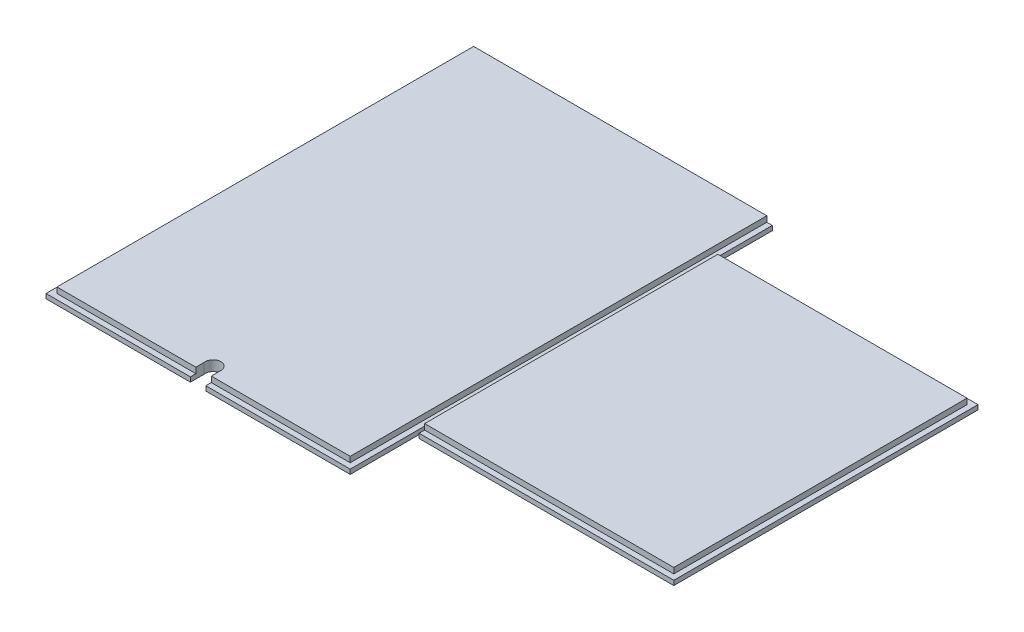
ISO-10303-21;
HEADER;
FILE_DESCRIPTION(('STEP AP214'),'2;1');
FILE_NAME('part.step','',(''),(''),'','','');
FILE_SCHEMA(('AUTOMOTIVE_DESIGN { 1 0 10303 214 1 1 1 1 }'));
ENDSEC;
DATA;
#1=APPLICATION_CONTEXT('core data for automotive mechanical design processes');
#2=APPLICATION_PROTOCOL_DEFINITION('international standard','automotive_design',2000,#1);
#3=PRODUCT_CONTEXT('',#1,'mechanical');
#4=PRODUCT('Part','Part','',(#3));
#5=PRODUCT_RELATED_PRODUCT_CATEGORY('part','',(#4));
#6=PRODUCT_DEFINITION_FORMATION('','',#4);
#7=PRODUCT_DEFINITION_CONTEXT('part definition',#1,'design');
#8=PRODUCT_DEFINITION('design','',#6,#7);
#9=PRODUCT_DEFINITION_SHAPE('','',#8);
#10=(LENGTH_UNIT() NAMED_UNIT(*) SI_UNIT(.MILLI.,.METRE.));
#11=(NAMED_UNIT(*) PLANE_ANGLE_UNIT() SI_UNIT($,.RADIAN.));
#12=(NAMED_UNIT(*) SI_UNIT($,.STERADIAN.) SOLID_ANGLE_UNIT());
#13=UNCERTAINTY_MEASURE_WITH_UNIT(LENGTH_MEASURE(1.E-05),#10,'distance_accuracy_value','');
#14=(GEOMETRIC_REPRESENTATION_CONTEXT(3) GLOBAL_UNCERTAINTY_ASSIGNED_CONTEXT((#13)) GLOBAL_UNIT_ASSIGNED_CONTEXT((#10,
#11,#12)) REPRESENTATION_CONTEXT('',''));
#15=CARTESIAN_POINT('',(0.,0.,0.));
#16=DIRECTION('',(0.,0.,1.));
#17=DIRECTION('',(1.,0.,0.));
#18=AXIS2_PLACEMENT_3D('',#15,#16,#17);
#19=CARTESIAN_POINT('',(32.2556284153005,3.,-34.5595316159251));
#20=DIRECTION('',(1.,0.,0.));
#21=DIRECTION('',(0.,0.,-1.));
#22=AXIS2_PLACEMENT_3D('',#19,#20,#21);
#23=PLANE('',#22);
#24=DIRECTION('',(0.,1.,0.));
#25=VECTOR('',#24,1.);
#26=CARTESIAN_POINT('',(32.2556284153005,1.35,52.8404683840749));
#27=LINE('',#26,#25);
#28=CARTESIAN_POINT('',(32.2556284153005,1.35,52.8404683840749));
#29=VERTEX_POINT('',#28);
#30=CARTESIAN_POINT('',(32.2556284153005,3.,52.8404683840749));
#31=VERTEX_POINT('',#30);
#32=EDGE_CURVE('E145',#29,#31,#27,.T.);
#33=ORIENTED_EDGE('',*,*,#32,.T.);
#34=DIRECTION('',(0.,0.,1.));
#35=VECTOR('',#34,1.);
#36=CARTESIAN_POINT('',(32.2556284153005,3.,-34.5595316159251));
#37=LINE('',#36,#35);
#38=CARTESIAN_POINT('',(32.2556284153005,3.,-32.9595316159251));
#39=VERTEX_POINT('',#38);
#40=EDGE_CURVE('E134',#39,#31,#37,.T.);
#41=ORIENTED_EDGE('',*,*,#40,.F.);
#42=DIRECTION('',(0.,1.,0.));
#43=VECTOR('',#42,1.);
#44=CARTESIAN_POINT('',(32.2556284153005,1.35,-32.9595316159251));
#45=LINE('',#44,#43);
#46=CARTESIAN_POINT('',(32.2556284153005,1.35,-32.9595316159251));
#47=VERTEX_POINT('',#46);
#48=EDGE_CURVE('E61',#47,#39,#45,.T.);
#49=ORIENTED_EDGE('',*,*,#48,.F.);
#50=DIRECTION('',(0.,0.,-1.));
#51=VECTOR('',#50,1.);
#52=CARTESIAN_POINT('',(32.2556284153005,1.35,-32.9595316159251));
#53=LINE('',#52,#51);
#54=CARTESIAN_POINT('',(32.2556284153005,1.35,-34.5595316159251));
#55=VERTEX_POINT('',#54);
#56=EDGE_CURVE('E155',#47,#55,#53,.T.);
#57=ORIENTED_EDGE('',*,*,#56,.T.);
#58=DIRECTION('',(0.,-1.,0.));
#59=VECTOR('',#58,1.);
#60=CARTESIAN_POINT('',(32.2556284153005,3.,-34.5595316159251));
#61=LINE('',#60,#59);
#62=CARTESIAN_POINT('',(32.2556284153005,0.,-34.5595316159251));
#63=VERTEX_POINT('',#62);
#64=EDGE_CURVE('E69',#55,#63,#61,.T.);
#65=ORIENTED_EDGE('',*,*,#64,.T.);
#66=DIRECTION('',(0.,0.,1.));
#67=VECTOR('',#66,1.);
#68=CARTESIAN_POINT('',(32.2556284153005,0.,-34.5595316159251));
#69=LINE('',#68,#67);
#70=CARTESIAN_POINT('',(32.2556284153005,0.,54.4404683840749));
#71=VERTEX_POINT('',#70);
#72=EDGE_CURVE('E143',#63,#71,#69,.T.);
#73=ORIENTED_EDGE('',*,*,#72,.T.);
#74=DIRECTION('',(0.,-1.,0.));
#75=VECTOR('',#74,1.);
#76=CARTESIAN_POINT('',(32.2556284153005,3.,54.4404683840749));
#77=LINE('',#76,#75);
#78=CARTESIAN_POINT('',(32.2556284153005,1.35,54.4404683840749));
#79=VERTEX_POINT('',#78);
#80=EDGE_CURVE('E12',#79,#71,#77,.T.);
#81=ORIENTED_EDGE('',*,*,#80,.F.);
#82=DIRECTION('',(0.,0.,-1.));
#83=VECTOR('',#82,1.);
#84=CARTESIAN_POINT('',(32.2556284153005,1.35,54.4404683840749));
#85=LINE('',#84,#83);
#86=EDGE_CURVE('E170',#79,#29,#85,.T.);
#87=ORIENTED_EDGE('',*,*,#86,.T.);
#88=EDGE_LOOP('',(#33,#41,#49,#57,#65,#73,#81,#87));
#89=FACE_BOUND('',#88,.T.);
#90=ADVANCED_FACE('F47',(#89),#23,.F.);
#91=CARTESIAN_POINT('',(0.,3.,0.));
#92=DIRECTION('',(0.,1.,0.));
#93=DIRECTION('',(0.,0.,1.));
#94=AXIS2_PLACEMENT_3D('',#91,#92,#93);
#95=PLANE('',#94);
#96=ORIENTED_EDGE('',*,*,#40,.T.);
#97=DIRECTION('',(1.,0.,0.));
#98=VECTOR('',#97,1.);
#99=CARTESIAN_POINT('',(32.2556284153005,3.,52.8404683840749));
#100=LINE('',#99,#98);
#101=CARTESIAN_POINT('',(105.155628415301,3.,52.8404683840749));
#102=VERTEX_POINT('',#101);
#103=EDGE_CURVE('E160',#31,#102,#100,.T.);
#104=ORIENTED_EDGE('',*,*,#103,.T.);
#105=DIRECTION('',(0.,0.,-1.));
#106=VECTOR('',#105,1.);
#107=CARTESIAN_POINT('',(105.155628415301,3.,52.8404683840749));
#108=LINE('',#107,#106);
#109=CARTESIAN_POINT('',(105.155628415301,3.,-32.9595316159251));
#110=VERTEX_POINT('',#109);
#111=EDGE_CURVE('E157',#102,#110,#108,.T.);
#112=ORIENTED_EDGE('',*,*,#111,.T.);
#113=DIRECTION('',(-1.,0.,0.));
#114=VECTOR('',#113,1.);
#115=CARTESIAN_POINT('',(105.155628415301,3.,-32.9595316159251));
#116=LINE('',#115,#114);
#117=EDGE_CURVE('E127',#110,#39,#116,.T.);
#118=ORIENTED_EDGE('',*,*,#117,.T.);
#119=EDGE_LOOP('',(#96,#104,#112,#118));
#120=FACE_BOUND('',#119,.T.);
#121=ADVANCED_FACE('F193',(#120),#95,.T.);
#122=CARTESIAN_POINT('',(32.2556284153005,3.,54.4404683840749));
#123=DIRECTION('',(0.,0.,-1.));
#124=DIRECTION('',(-1.,0.,0.));
#125=AXIS2_PLACEMENT_3D('',#122,#123,#124);
#126=PLANE('',#125);
#127=DIRECTION('',(0.,-1.,0.));
#128=VECTOR('',#127,1.);
#129=CARTESIAN_POINT('',(106.755628415301,3.,54.4404683840749));
#130=LINE('',#129,#128);
#131=CARTESIAN_POINT('',(106.755628415301,1.35,54.4404683840749));
#132=VERTEX_POINT('',#131);
#133=CARTESIAN_POINT('',(106.755628415301,0.,54.4404683840749));
#134=VERTEX_POINT('',#133);
#135=EDGE_CURVE('E54',#132,#134,#130,.T.);
#136=ORIENTED_EDGE('',*,*,#135,.F.);
#137=DIRECTION('',(-1.,0.,0.));
#138=VECTOR('',#137,1.);
#139=CARTESIAN_POINT('',(106.755628415301,1.35,54.4404683840749));
#140=LINE('',#139,#138);
#141=EDGE_CURVE('E118',#132,#79,#140,.T.);
#142=ORIENTED_EDGE('',*,*,#141,.T.);
#143=ORIENTED_EDGE('',*,*,#80,.T.);
#144=DIRECTION('',(1.,0.,0.));
#145=VECTOR('',#144,1.);
#146=CARTESIAN_POINT('',(32.2556284153005,0.,54.4404683840749));
#147=LINE('',#146,#145);
#148=EDGE_CURVE('E140',#71,#134,#147,.T.);
#149=ORIENTED_EDGE('',*,*,#148,.T.);
#150=EDGE_LOOP('',(#136,#142,#143,#149));
#151=FACE_BOUND('',#150,.T.);
#152=ADVANCED_FACE('F175',(#151),#126,.F.);
#153=CARTESIAN_POINT('',(106.755628415301,3.,-34.5595316159251));
#154=DIRECTION('',(-1.,0.,0.));
#155=DIRECTION('',(0.,0.,1.));
#156=AXIS2_PLACEMENT_3D('',#153,#154,#155);
#157=PLANE('',#156);
#158=DIRECTION('',(0.,-1.,0.));
#159=VECTOR('',#158,1.);
#160=CARTESIAN_POINT('',(106.755628415301,3.,-34.5595316159251));
#161=LINE('',#160,#159);
#162=CARTESIAN_POINT('',(106.755628415301,1.35,-34.5595316159251));
#163=VERTEX_POINT('',#162);
#164=CARTESIAN_POINT('',(106.755628415301,0.,-34.5595316159251));
#165=VERTEX_POINT('',#164);
#166=EDGE_CURVE('E125',#163,#165,#161,.T.);
#167=ORIENTED_EDGE('',*,*,#166,.F.);
#168=DIRECTION('',(0.,0.,1.));
#169=VECTOR('',#168,1.);
#170=CARTESIAN_POINT('',(106.755628415301,1.35,-34.5595316159251));
#171=LINE('',#170,#169);
#172=EDGE_CURVE('E112',#163,#132,#171,.T.);
#173=ORIENTED_EDGE('',*,*,#172,.T.);
#174=ORIENTED_EDGE('',*,*,#135,.T.);
#175=DIRECTION('',(0.,0.,-1.));
#176=VECTOR('',#175,1.);
#177=CARTESIAN_POINT('',(106.755628415301,0.,-34.5595316159251));
#178=LINE('',#177,#176);
#179=EDGE_CURVE('E131',#134,#165,#178,.T.);
#180=ORIENTED_EDGE('',*,*,#179,.T.);
#181=EDGE_LOOP('',(#167,#173,#174,#180));
#182=FACE_BOUND('',#181,.T.);
#183=ADVANCED_FACE('F129',(#182),#157,.F.);
#184=CARTESIAN_POINT('',(32.2556284153005,3.,-34.5595316159251));
#185=DIRECTION('',(0.,0.,1.));
#186=DIRECTION('',(1.,0.,0.));
#187=AXIS2_PLACEMENT_3D('',#184,#185,#186);
#188=PLANE('',#187);
#189=ORIENTED_EDGE('',*,*,#64,.F.);
#190=DIRECTION('',(1.,0.,0.));
#191=VECTOR('',#190,1.);
#192=CARTESIAN_POINT('',(32.2556284153005,1.35,-34.5595316159251));
#193=LINE('',#192,#191);
#194=EDGE_CURVE('E116',#55,#163,#193,.T.);
#195=ORIENTED_EDGE('',*,*,#194,.T.);
#196=ORIENTED_EDGE('',*,*,#166,.T.);
#197=DIRECTION('',(-1.,0.,0.));
#198=VECTOR('',#197,1.);
#199=CARTESIAN_POINT('',(32.2556284153005,0.,-34.5595316159251));
#200=LINE('',#199,#198);
#201=EDGE_CURVE('E137',#165,#63,#200,.T.);
#202=ORIENTED_EDGE('',*,*,#201,.T.);
#203=EDGE_LOOP('',(#189,#195,#196,#202));
#204=FACE_BOUND('',#203,.T.);
#205=ADVANCED_FACE('F124',(#204),#188,.F.);
#206=CARTESIAN_POINT('',(0.,0.,0.));
#207=DIRECTION('',(0.,1.,0.));
#208=DIRECTION('',(0.,0.,1.));
#209=AXIS2_PLACEMENT_3D('',#206,#207,#208);
#210=PLANE('',#209);
#211=ORIENTED_EDGE('',*,*,#72,.F.);
#212=ORIENTED_EDGE('',*,*,#201,.F.);
#213=ORIENTED_EDGE('',*,*,#179,.F.);
#214=ORIENTED_EDGE('',*,*,#148,.F.);
#215=EDGE_LOOP('',(#211,#212,#213,#214));
#216=FACE_BOUND('',#215,.T.);
#217=ADVANCED_FACE('F179',(#216),#210,.F.);
#218=CARTESIAN_POINT('',(32.2556284153005,1.35,52.8404683840749));
#219=DIRECTION('',(0.,0.,1.));
#220=DIRECTION('',(1.,0.,0.));
#221=AXIS2_PLACEMENT_3D('',#218,#219,#220);
#222=PLANE('',#221);
#223=ORIENTED_EDGE('',*,*,#103,.F.);
#224=ORIENTED_EDGE('',*,*,#32,.F.);
#225=DIRECTION('',(1.,0.,0.));
#226=VECTOR('',#225,1.);
#227=CARTESIAN_POINT('',(32.2556284153005,1.35,52.8404683840749));
#228=LINE('',#227,#226);
#229=CARTESIAN_POINT('',(105.155628415301,1.35,52.8404683840749));
#230=VERTEX_POINT('',#229);
#231=EDGE_CURVE('E168',#29,#230,#228,.T.);
#232=ORIENTED_EDGE('',*,*,#231,.T.);
#233=DIRECTION('',(0.,1.,0.));
#234=VECTOR('',#233,1.);
#235=CARTESIAN_POINT('',(105.155628415301,1.35,52.8404683840749));
#236=LINE('',#235,#234);
#237=EDGE_CURVE('E150',#230,#102,#236,.T.);
#238=ORIENTED_EDGE('',*,*,#237,.T.);
#239=EDGE_LOOP('',(#223,#224,#232,#238));
#240=FACE_BOUND('',#239,.T.);
#241=ADVANCED_FACE('F181',(#240),#222,.T.);
#242=CARTESIAN_POINT('',(105.155628415301,1.35,52.8404683840749));
#243=DIRECTION('',(1.,0.,0.));
#244=DIRECTION('',(0.,0.,-1.));
#245=AXIS2_PLACEMENT_3D('',#242,#243,#244);
#246=PLANE('',#245);
#247=ORIENTED_EDGE('',*,*,#111,.F.);
#248=ORIENTED_EDGE('',*,*,#237,.F.);
#249=DIRECTION('',(0.,0.,-1.));
#250=VECTOR('',#249,1.);
#251=CARTESIAN_POINT('',(105.155628415301,1.35,52.8404683840749));
#252=LINE('',#251,#250);
#253=CARTESIAN_POINT('',(105.155628415301,1.35,-32.9595316159251));
#254=VERTEX_POINT('',#253);
#255=EDGE_CURVE('E166',#230,#254,#252,.T.);
#256=ORIENTED_EDGE('',*,*,#255,.T.);
#257=DIRECTION('',(0.,1.,0.));
#258=VECTOR('',#257,1.);
#259=CARTESIAN_POINT('',(105.155628415301,1.35,-32.9595316159251));
#260=LINE('',#259,#258);
#261=EDGE_CURVE('E152',#254,#110,#260,.T.);
#262=ORIENTED_EDGE('',*,*,#261,.T.);
#263=EDGE_LOOP('',(#247,#248,#256,#262));
#264=FACE_BOUND('',#263,.T.);
#265=ADVANCED_FACE('F187',(#264),#246,.T.);
#266=CARTESIAN_POINT('',(105.155628415301,1.35,-32.9595316159251));
#267=DIRECTION('',(0.,0.,-1.));
#268=DIRECTION('',(-1.,0.,0.));
#269=AXIS2_PLACEMENT_3D('',#266,#267,#268);
#270=PLANE('',#269);
#271=ORIENTED_EDGE('',*,*,#117,.F.);
#272=ORIENTED_EDGE('',*,*,#261,.F.);
#273=DIRECTION('',(-1.,0.,0.));
#274=VECTOR('',#273,1.);
#275=CARTESIAN_POINT('',(105.155628415301,1.35,-32.9595316159251));
#276=LINE('',#275,#274);
#277=EDGE_CURVE('E164',#254,#47,#276,.T.);
#278=ORIENTED_EDGE('',*,*,#277,.T.);
#279=ORIENTED_EDGE('',*,*,#48,.T.);
#280=EDGE_LOOP('',(#271,#272,#278,#279));
#281=FACE_BOUND('',#280,.T.);
#282=ADVANCED_FACE('F204',(#281),#270,.T.);
#283=CARTESIAN_POINT('',(0.,1.35,0.));
#284=DIRECTION('',(0.,-1.,0.));
#285=DIRECTION('',(0.,0.,-1.));
#286=AXIS2_PLACEMENT_3D('',#283,#284,#285);
#287=PLANE('',#286);
#288=ORIENTED_EDGE('',*,*,#194,.F.);
#289=ORIENTED_EDGE('',*,*,#56,.F.);
#290=ORIENTED_EDGE('',*,*,#277,.F.);
#291=ORIENTED_EDGE('',*,*,#255,.F.);
#292=ORIENTED_EDGE('',*,*,#231,.F.);
#293=ORIENTED_EDGE('',*,*,#86,.F.);
#294=ORIENTED_EDGE('',*,*,#141,.F.);
#295=ORIENTED_EDGE('',*,*,#172,.F.);
#296=EDGE_LOOP('',(#288,#289,#290,#291,#292,#293,#294,#295));
#297=FACE_BOUND('',#296,.T.);
#298=ADVANCED_FACE('F114',(#297),#287,.F.);
#299=CLOSED_SHELL('',(#90,#121,#152,#183,#205,#217,#241,#265,#282,#298));
#300=MANIFOLD_SOLID_BREP('B2',#299);
#301=CARTESIAN_POINT('',(-57.7449667447307,3.,73.6127344262295));
#302=DIRECTION('',(0.,0.,-1.));
#303=DIRECTION('',(-1.,0.,0.));
#304=AXIS2_PLACEMENT_3D('',#301,#302,#303);
#305=PLANE('',#304);
#306=DIRECTION('',(1.,0.,0.));
#307=VECTOR('',#306,1.);
#308=CARTESIAN_POINT('',(-57.7449667447307,1.35,73.6127344262295));
#309=LINE('',#308,#307);
#310=CARTESIAN_POINT('',(-10.9949667447307,1.35,73.6127344262295));
#311=VERTEX_POINT('',#310);
#312=CARTESIAN_POINT('',(31.2550332552693,1.35,73.6127344262295));
#313=VERTEX_POINT('',#312);
#314=EDGE_CURVE('E417',#311,#313,#309,.T.);
#315=ORIENTED_EDGE('',*,*,#314,.F.);
#316=DIRECTION('',(0.,1.,0.));
#317=VECTOR('',#316,1.);
#318=CARTESIAN_POINT('',(-10.9949667447307,-3.,73.6127344262295));
#319=LINE('',#318,#317);
#320=CARTESIAN_POINT('',(-10.9949667447307,0.,73.6127344262295));
#321=VERTEX_POINT('',#320);
#322=EDGE_CURVE('E403',#321,#311,#319,.T.);
#323=ORIENTED_EDGE('',*,*,#322,.F.);
#324=DIRECTION('',(1.,0.,0.));
#325=VECTOR('',#324,1.);
#326=CARTESIAN_POINT('',(-57.7449667447307,0.,73.6127344262295));
#327=LINE('',#326,#325);
#328=CARTESIAN_POINT('',(31.2550332552693,0.,73.6127344262295));
#329=VERTEX_POINT('',#328);
#330=EDGE_CURVE('E462',#321,#329,#327,.T.);
#331=ORIENTED_EDGE('',*,*,#330,.T.);
#332=DIRECTION('',(0.,-1.,0.));
#333=VECTOR('',#332,1.);
#334=CARTESIAN_POINT('',(31.2550332552693,3.,73.6127344262295));
#335=LINE('',#334,#333);
#336=EDGE_CURVE('E474',#313,#329,#335,.T.);
#337=ORIENTED_EDGE('',*,*,#336,.F.);
#338=EDGE_LOOP('',(#315,#323,#331,#337));
#339=FACE_BOUND('',#338,.T.);
#340=ADVANCED_FACE('F275',(#339),#305,.F.);
#341=CARTESIAN_POINT('',(29.6550332552693,1.35,72.0127344262295));
#342=DIRECTION('',(0.,0.,-1.));
#343=DIRECTION('',(-1.,0.,0.));
#344=AXIS2_PLACEMENT_3D('',#341,#342,#343);
#345=PLANE('',#344);
#346=DIRECTION('',(-1.,0.,0.));
#347=VECTOR('',#346,1.);
#348=CARTESIAN_POINT('',(29.6550332552693,3.,72.0127344262295));
#349=LINE('',#348,#347);
#350=CARTESIAN_POINT('',(29.6550332552693,3.,72.0127344262295));
#351=VERTEX_POINT('',#350);
#352=CARTESIAN_POINT('',(-10.9949667447307,3.,72.0127344262295));
#353=VERTEX_POINT('',#352);
#354=EDGE_CURVE('E428',#351,#353,#349,.T.);
#355=ORIENTED_EDGE('',*,*,#354,.T.);
#356=DIRECTION('',(0.,-1.,0.));
#357=VECTOR('',#356,1.);
#358=CARTESIAN_POINT('',(-10.9949667447307,1.35,72.0127344262295));
#359=LINE('',#358,#357);
#360=CARTESIAN_POINT('',(-10.9949667447307,1.35,72.0127344262295));
#361=VERTEX_POINT('',#360);
#362=EDGE_CURVE('E409',#353,#361,#359,.T.);
#363=ORIENTED_EDGE('',*,*,#362,.T.);
#364=DIRECTION('',(-1.,0.,0.));
#365=VECTOR('',#364,1.);
#366=CARTESIAN_POINT('',(29.6550332552693,1.35,72.0127344262295));
#367=LINE('',#366,#365);
#368=CARTESIAN_POINT('',(29.6550332552693,1.35,72.0127344262295));
#369=VERTEX_POINT('',#368);
#370=EDGE_CURVE('E445',#369,#361,#367,.T.);
#371=ORIENTED_EDGE('',*,*,#370,.F.);
#372=DIRECTION('',(0.,1.,0.));
#373=VECTOR('',#372,1.);
#374=CARTESIAN_POINT('',(29.6550332552693,1.35,72.0127344262295));
#375=LINE('',#374,#373);
#376=EDGE_CURVE('E418',#369,#351,#375,.T.);
#377=ORIENTED_EDGE('',*,*,#376,.T.);
#378=EDGE_LOOP('',(#355,#363,#371,#377));
#379=FACE_BOUND('',#378,.T.);
#380=ADVANCED_FACE('F488',(#379),#345,.F.);
#381=CARTESIAN_POINT('',(0.,1.35,0.));
#382=DIRECTION('',(0.,1.,0.));
#383=DIRECTION('',(0.,0.,1.));
#384=AXIS2_PLACEMENT_3D('',#381,#382,#383);
#385=PLANE('',#384);
#386=DIRECTION('',(0.,0.,-1.));
#387=VECTOR('',#386,1.);
#388=CARTESIAN_POINT('',(-10.9949667447307,1.35,0.));
#389=LINE('',#388,#387);
#390=EDGE_CURVE('E283',#311,#361,#389,.T.);
#391=ORIENTED_EDGE('',*,*,#390,.F.);
#392=ORIENTED_EDGE('',*,*,#314,.T.);
#393=DIRECTION('',(0.,0.,-1.));
#394=VECTOR('',#393,1.);
#395=CARTESIAN_POINT('',(31.2550332552693,1.35,73.6127344262295));
#396=LINE('',#395,#394);
#397=CARTESIAN_POINT('',(31.2550332552693,1.35,-49.8872655737705));
#398=VERTEX_POINT('',#397);
#399=EDGE_CURVE('E427',#313,#398,#396,.T.);
#400=ORIENTED_EDGE('',*,*,#399,.T.);
#401=DIRECTION('',(-1.,0.,0.));
#402=VECTOR('',#401,1.);
#403=CARTESIAN_POINT('',(31.2550332552693,1.35,-49.8872655737705));
#404=LINE('',#403,#402);
#405=CARTESIAN_POINT('',(29.6550332552693,1.35,-49.8872655737705));
#406=VERTEX_POINT('',#405);
#407=EDGE_CURVE('E451',#398,#406,#404,.T.);
#408=ORIENTED_EDGE('',*,*,#407,.T.);
#409=DIRECTION('',(0.,0.,1.));
#410=VECTOR('',#409,1.);
#411=CARTESIAN_POINT('',(29.6550332552693,1.35,-49.8872655737705));
#412=LINE('',#411,#410);
#413=EDGE_CURVE('E448',#406,#369,#412,.T.);
#414=ORIENTED_EDGE('',*,*,#413,.T.);
#415=ORIENTED_EDGE('',*,*,#370,.T.);
#416=EDGE_LOOP('',(#391,#392,#400,#408,#414,#415));
#417=FACE_BOUND('',#416,.T.);
#418=ADVANCED_FACE('F490',(#417),#385,.T.);
#419=CARTESIAN_POINT('',(-57.7449667447307,3.,-49.8872655737705));
#420=DIRECTION('',(1.,0.,0.));
#421=DIRECTION('',(0.,0.,-1.));
#422=AXIS2_PLACEMENT_3D('',#419,#420,#421);
#423=PLANE('',#422);
#424=DIRECTION('',(0.,0.,1.));
#425=VECTOR('',#424,1.);
#426=CARTESIAN_POINT('',(-57.7449667447307,1.35,-49.8872655737705));
#427=LINE('',#426,#425);
#428=CARTESIAN_POINT('',(-57.7449667447307,1.35,-49.8872655737705));
#429=VERTEX_POINT('',#428);
#430=CARTESIAN_POINT('',(-57.7449667447307,1.35,73.6127344262295));
#431=VERTEX_POINT('',#430);
#432=EDGE_CURVE('E437',#429,#431,#427,.T.);
#433=ORIENTED_EDGE('',*,*,#432,.F.);
#434=DIRECTION('',(0.,-1.,0.));
#435=VECTOR('',#434,1.);
#436=CARTESIAN_POINT('',(-57.7449667447307,3.,-49.8872655737705));
#437=LINE('',#436,#435);
#438=CARTESIAN_POINT('',(-57.7449667447307,0.,-49.8872655737705));
#439=VERTEX_POINT('',#438);
#440=EDGE_CURVE('E458',#429,#439,#437,.T.);
#441=ORIENTED_EDGE('',*,*,#440,.T.);
#442=DIRECTION('',(0.,0.,1.));
#443=VECTOR('',#442,1.);
#444=CARTESIAN_POINT('',(-57.7449667447307,0.,-49.8872655737705));
#445=LINE('',#444,#443);
#446=CARTESIAN_POINT('',(-57.7449667447307,0.,73.6127344262295));
#447=VERTEX_POINT('',#446);
#448=EDGE_CURVE('E433',#439,#447,#445,.T.);
#449=ORIENTED_EDGE('',*,*,#448,.T.);
#450=DIRECTION('',(0.,-1.,0.));
#451=VECTOR('',#450,1.);
#452=CARTESIAN_POINT('',(-57.7449667447307,3.,73.6127344262295));
#453=LINE('',#452,#451);
#454=EDGE_CURVE('E477',#431,#447,#453,.T.);
#455=ORIENTED_EDGE('',*,*,#454,.F.);
#456=EDGE_LOOP('',(#433,#441,#449,#455));
#457=FACE_BOUND('',#456,.T.);
#458=ADVANCED_FACE('F277',(#457),#423,.F.);
#459=CARTESIAN_POINT('',(-15.4949667447307,0.,73.6127344262295));
#460=VERTEX_POINT('',#459);
#461=EDGE_CURVE('E463',#447,#460,#327,.T.);
#462=ORIENTED_EDGE('',*,*,#461,.T.);
#463=DIRECTION('',(0.,1.,0.));
#464=VECTOR('',#463,1.);
#465=CARTESIAN_POINT('',(-15.4949667447307,-3.,73.6127344262295));
#466=LINE('',#465,#464);
#467=CARTESIAN_POINT('',(-15.4949667447307,1.35,73.6127344262295));
#468=VERTEX_POINT('',#467);
#469=EDGE_CURVE('E383',#460,#468,#466,.T.);
#470=ORIENTED_EDGE('',*,*,#469,.T.);
#471=EDGE_CURVE('E434',#431,#468,#309,.T.);
#472=ORIENTED_EDGE('',*,*,#471,.F.);
#473=ORIENTED_EDGE('',*,*,#454,.T.);
#474=EDGE_LOOP('',(#462,#470,#472,#473));
#475=FACE_BOUND('',#474,.T.);
#476=ADVANCED_FACE('F519',(#475),#305,.F.);
#477=CARTESIAN_POINT('',(31.2550332552693,3.,-49.8872655737705));
#478=DIRECTION('',(-1.,0.,0.));
#479=DIRECTION('',(0.,0.,1.));
#480=AXIS2_PLACEMENT_3D('',#477,#478,#479);
#481=PLANE('',#480);
#482=ORIENTED_EDGE('',*,*,#399,.F.);
#483=ORIENTED_EDGE('',*,*,#336,.T.);
#484=DIRECTION('',(0.,0.,-1.));
#485=VECTOR('',#484,1.);
#486=CARTESIAN_POINT('',(31.2550332552693,0.,-49.8872655737705));
#487=LINE('',#486,#485);
#488=CARTESIAN_POINT('',(31.2550332552693,0.,-49.8872655737705));
#489=VERTEX_POINT('',#488);
#490=EDGE_CURVE('E466',#329,#489,#487,.T.);
#491=ORIENTED_EDGE('',*,*,#490,.T.);
#492=DIRECTION('',(0.,-1.,0.));
#493=VECTOR('',#492,1.);
#494=CARTESIAN_POINT('',(31.2550332552693,3.,-49.8872655737705));
#495=LINE('',#494,#493);
#496=EDGE_CURVE('E472',#398,#489,#495,.T.);
#497=ORIENTED_EDGE('',*,*,#496,.F.);
#498=EDGE_LOOP('',(#482,#483,#491,#497));
#499=FACE_BOUND('',#498,.T.);
#500=ADVANCED_FACE('F503',(#499),#481,.F.);
#501=CARTESIAN_POINT('',(-57.7449667447307,3.,-49.8872655737705));
#502=DIRECTION('',(0.,0.,1.));
#503=DIRECTION('',(1.,0.,0.));
#504=AXIS2_PLACEMENT_3D('',#501,#502,#503);
#505=PLANE('',#504);
#506=DIRECTION('',(-1.,0.,0.));
#507=VECTOR('',#506,1.);
#508=CARTESIAN_POINT('',(-57.7449667447307,3.,-49.8872655737705));
#509=LINE('',#508,#507);
#510=CARTESIAN_POINT('',(29.6550332552693,3.,-49.8872655737705));
#511=VERTEX_POINT('',#510);
#512=CARTESIAN_POINT('',(-56.1449667447307,3.,-49.8872655737705));
#513=VERTEX_POINT('',#512);
#514=EDGE_CURVE('E455',#511,#513,#509,.T.);
#515=ORIENTED_EDGE('',*,*,#514,.F.);
#516=DIRECTION('',(0.,1.,0.));
#517=VECTOR('',#516,1.);
#518=CARTESIAN_POINT('',(29.6550332552693,1.35,-49.8872655737705));
#519=LINE('',#518,#517);
#520=EDGE_CURVE('E298',#406,#511,#519,.T.);
#521=ORIENTED_EDGE('',*,*,#520,.F.);
#522=ORIENTED_EDGE('',*,*,#407,.F.);
#523=ORIENTED_EDGE('',*,*,#496,.T.);
#524=DIRECTION('',(-1.,0.,0.));
#525=VECTOR('',#524,1.);
#526=CARTESIAN_POINT('',(-57.7449667447307,0.,-49.8872655737705));
#527=LINE('',#526,#525);
#528=EDGE_CURVE('E459',#489,#439,#527,.T.);
#529=ORIENTED_EDGE('',*,*,#528,.T.);
#530=ORIENTED_EDGE('',*,*,#440,.F.);
#531=DIRECTION('',(-1.,0.,0.));
#532=VECTOR('',#531,1.);
#533=CARTESIAN_POINT('',(-56.1449667447307,1.35,-49.8872655737705));
#534=LINE('',#533,#532);
#535=CARTESIAN_POINT('',(-56.1449667447307,1.35,-49.8872655737705));
#536=VERTEX_POINT('',#535);
#537=EDGE_CURVE('E439',#536,#429,#534,.T.);
#538=ORIENTED_EDGE('',*,*,#537,.F.);
#539=DIRECTION('',(0.,1.,0.));
#540=VECTOR('',#539,1.);
#541=CARTESIAN_POINT('',(-56.1449667447307,1.35,-49.8872655737705));
#542=LINE('',#541,#540);
#543=EDGE_CURVE('E415',#536,#513,#542,.T.);
#544=ORIENTED_EDGE('',*,*,#543,.T.);
#545=EDGE_LOOP('',(#515,#521,#522,#523,#529,#530,#538,#544));
#546=FACE_BOUND('',#545,.T.);
#547=ADVANCED_FACE('F506',(#546),#505,.F.);
#548=CARTESIAN_POINT('',(0.,3.,0.));
#549=DIRECTION('',(0.,1.,0.));
#550=DIRECTION('',(0.,0.,1.));
#551=AXIS2_PLACEMENT_3D('',#548,#549,#550);
#552=PLANE('',#551);
#553=DIRECTION('',(0.,0.,-1.));
#554=VECTOR('',#553,1.);
#555=CARTESIAN_POINT('',(-10.9949667447307,3.,73.6127344262295));
#556=LINE('',#555,#554);
#557=CARTESIAN_POINT('',(-10.9949667447307,3.,69.6127344262295));
#558=VERTEX_POINT('',#557);
#559=EDGE_CURVE('E384',#353,#558,#556,.T.);
#560=ORIENTED_EDGE('',*,*,#559,.F.);
#561=ORIENTED_EDGE('',*,*,#354,.F.);
#562=DIRECTION('',(0.,0.,1.));
#563=VECTOR('',#562,1.);
#564=CARTESIAN_POINT('',(29.6550332552693,3.,-49.8872655737705));
#565=LINE('',#564,#563);
#566=EDGE_CURVE('E431',#511,#351,#565,.T.);
#567=ORIENTED_EDGE('',*,*,#566,.F.);
#568=ORIENTED_EDGE('',*,*,#514,.T.);
#569=DIRECTION('',(0.,0.,-1.));
#570=VECTOR('',#569,1.);
#571=CARTESIAN_POINT('',(-56.1449667447307,3.,72.0127344262295));
#572=LINE('',#571,#570);
#573=CARTESIAN_POINT('',(-56.1449667447307,3.,72.0127344262295));
#574=VERTEX_POINT('',#573);
#575=EDGE_CURVE('E425',#574,#513,#572,.T.);
#576=ORIENTED_EDGE('',*,*,#575,.F.);
#577=CARTESIAN_POINT('',(-15.4949667447307,3.,72.0127344262295));
#578=VERTEX_POINT('',#577);
#579=EDGE_CURVE('E398',#578,#574,#349,.T.);
#580=ORIENTED_EDGE('',*,*,#579,.F.);
#581=DIRECTION('',(0.,0.,1.));
#582=VECTOR('',#581,1.);
#583=CARTESIAN_POINT('',(-15.4949667447307,3.,73.6127344262295));
#584=LINE('',#583,#582);
#585=CARTESIAN_POINT('',(-15.4949667447307,3.,69.6127344262295));
#586=VERTEX_POINT('',#585);
#587=EDGE_CURVE('E379',#586,#578,#584,.T.);
#588=ORIENTED_EDGE('',*,*,#587,.F.);
#589=CARTESIAN_POINT('',(-13.2449667447307,3.,69.2321838803627));
#590=DIRECTION('',(0.,1.,0.));
#591=DIRECTION('',(0.,0.,-1.));
#592=AXIS2_PLACEMENT_3D('',#589,#590,#591);
#593=CIRCLE('',#592,2.28195502102024);
#594=EDGE_CURVE('E387',#558,#586,#593,.T.);
#595=ORIENTED_EDGE('',*,*,#594,.F.);
#596=EDGE_LOOP('',(#560,#561,#567,#568,#576,#580,#588,#595));
#597=FACE_BOUND('',#596,.T.);
#598=ADVANCED_FACE('F396',(#597),#552,.T.);
#599=CARTESIAN_POINT('',(0.,0.,0.));
#600=DIRECTION('',(0.,1.,0.));
#601=DIRECTION('',(0.,0.,1.));
#602=AXIS2_PLACEMENT_3D('',#599,#600,#601);
#603=PLANE('',#602);
#604=ORIENTED_EDGE('',*,*,#330,.F.);
#605=DIRECTION('',(0.,0.,-1.));
#606=VECTOR('',#605,1.);
#607=CARTESIAN_POINT('',(-10.9949667447307,0.,0.));
#608=LINE('',#607,#606);
#609=CARTESIAN_POINT('',(-10.9949667447307,0.,69.6127344262295));
#610=VERTEX_POINT('',#609);
#611=EDGE_CURVE('E412',#321,#610,#608,.T.);
#612=ORIENTED_EDGE('',*,*,#611,.T.);
#613=CARTESIAN_POINT('',(-13.2449667447307,0.,69.2321838803627));
#614=DIRECTION('',(0.,1.,0.));
#615=DIRECTION('',(0.,0.,1.));
#616=AXIS2_PLACEMENT_3D('',#613,#614,#615);
#617=CIRCLE('',#616,2.28195502102024);
#618=CARTESIAN_POINT('',(-15.4949667447307,0.,69.6127344262295));
#619=VERTEX_POINT('',#618);
#620=EDGE_CURVE('E45',#610,#619,#617,.T.);
#621=ORIENTED_EDGE('',*,*,#620,.T.);
#622=DIRECTION('',(0.,0.,1.));
#623=VECTOR('',#622,1.);
#624=CARTESIAN_POINT('',(-15.4949667447307,0.,0.));
#625=LINE('',#624,#623);
#626=EDGE_CURVE('E381',#619,#460,#625,.T.);
#627=ORIENTED_EDGE('',*,*,#626,.T.);
#628=ORIENTED_EDGE('',*,*,#461,.F.);
#629=ORIENTED_EDGE('',*,*,#448,.F.);
#630=ORIENTED_EDGE('',*,*,#528,.F.);
#631=ORIENTED_EDGE('',*,*,#490,.F.);
#632=EDGE_LOOP('',(#604,#612,#621,#627,#628,#629,#630,#631));
#633=FACE_BOUND('',#632,.T.);
#634=ADVANCED_FACE('F496',(#633),#603,.F.);
#635=CARTESIAN_POINT('',(-56.1449667447307,1.35,72.0127344262295));
#636=DIRECTION('',(1.,0.,0.));
#637=DIRECTION('',(0.,0.,-1.));
#638=AXIS2_PLACEMENT_3D('',#635,#636,#637);
#639=PLANE('',#638);
#640=ORIENTED_EDGE('',*,*,#575,.T.);
#641=ORIENTED_EDGE('',*,*,#543,.F.);
#642=DIRECTION('',(0.,0.,-1.));
#643=VECTOR('',#642,1.);
#644=CARTESIAN_POINT('',(-56.1449667447307,1.35,72.0127344262295));
#645=LINE('',#644,#643);
#646=CARTESIAN_POINT('',(-56.1449667447307,1.35,72.0127344262295));
#647=VERTEX_POINT('',#646);
#648=EDGE_CURVE('E441',#647,#536,#645,.T.);
#649=ORIENTED_EDGE('',*,*,#648,.F.);
#650=DIRECTION('',(0.,1.,0.));
#651=VECTOR('',#650,1.);
#652=CARTESIAN_POINT('',(-56.1449667447307,1.35,72.0127344262295));
#653=LINE('',#652,#651);
#654=EDGE_CURVE('E420',#647,#574,#653,.T.);
#655=ORIENTED_EDGE('',*,*,#654,.T.);
#656=EDGE_LOOP('',(#640,#641,#649,#655));
#657=FACE_BOUND('',#656,.T.);
#658=ADVANCED_FACE('F509',(#657),#639,.F.);
#659=CARTESIAN_POINT('',(-15.4949667447307,1.35,72.0127344262295));
#660=VERTEX_POINT('',#659);
#661=EDGE_CURVE('E444',#660,#647,#367,.T.);
#662=ORIENTED_EDGE('',*,*,#661,.F.);
#663=DIRECTION('',(0.,1.,0.));
#664=VECTOR('',#663,1.);
#665=CARTESIAN_POINT('',(-15.4949667447307,1.35,72.0127344262295));
#666=LINE('',#665,#664);
#667=EDGE_CURVE('E290',#660,#578,#666,.T.);
#668=ORIENTED_EDGE('',*,*,#667,.T.);
#669=ORIENTED_EDGE('',*,*,#579,.T.);
#670=ORIENTED_EDGE('',*,*,#654,.F.);
#671=EDGE_LOOP('',(#662,#668,#669,#670));
#672=FACE_BOUND('',#671,.T.);
#673=ADVANCED_FACE('F514',(#672),#345,.F.);
#674=CARTESIAN_POINT('',(29.6550332552693,1.35,-49.8872655737705));
#675=DIRECTION('',(-1.,0.,0.));
#676=DIRECTION('',(0.,0.,1.));
#677=AXIS2_PLACEMENT_3D('',#674,#675,#676);
#678=PLANE('',#677);
#679=ORIENTED_EDGE('',*,*,#566,.T.);
#680=ORIENTED_EDGE('',*,*,#376,.F.);
#681=ORIENTED_EDGE('',*,*,#413,.F.);
#682=ORIENTED_EDGE('',*,*,#520,.T.);
#683=EDGE_LOOP('',(#679,#680,#681,#682));
#684=FACE_BOUND('',#683,.T.);
#685=ADVANCED_FACE('F492',(#684),#678,.F.);
#686=DIRECTION('',(0.,0.,1.));
#687=VECTOR('',#686,1.);
#688=CARTESIAN_POINT('',(-15.4949667447307,1.35,0.));
#689=LINE('',#688,#687);
#690=EDGE_CURVE('E479',#660,#468,#689,.T.);
#691=ORIENTED_EDGE('',*,*,#690,.F.);
#692=ORIENTED_EDGE('',*,*,#661,.T.);
#693=ORIENTED_EDGE('',*,*,#648,.T.);
#694=ORIENTED_EDGE('',*,*,#537,.T.);
#695=ORIENTED_EDGE('',*,*,#432,.T.);
#696=ORIENTED_EDGE('',*,*,#471,.T.);
#697=EDGE_LOOP('',(#691,#692,#693,#694,#695,#696));
#698=FACE_BOUND('',#697,.T.);
#699=ADVANCED_FACE('F516',(#698),#385,.T.);
#700=CARTESIAN_POINT('',(-13.2449667447307,-3.,69.2321838803627));
#701=DIRECTION('',(0.,1.,0.));
#702=DIRECTION('',(0.,0.,1.));
#703=AXIS2_PLACEMENT_3D('',#700,#701,#702);
#704=CYLINDRICAL_SURFACE('',#703,2.28195502102024);
#705=DIRECTION('',(0.,1.,0.));
#706=VECTOR('',#705,1.);
#707=CARTESIAN_POINT('',(-10.9949667447307,-3.,69.6127344262295));
#708=LINE('',#707,#706);
#709=EDGE_CURVE('E390',#610,#558,#708,.T.);
#710=ORIENTED_EDGE('',*,*,#709,.T.);
#711=ORIENTED_EDGE('',*,*,#594,.T.);
#712=DIRECTION('',(0.,1.,0.));
#713=VECTOR('',#712,1.);
#714=CARTESIAN_POINT('',(-15.4949667447307,-3.,69.6127344262295));
#715=LINE('',#714,#713);
#716=EDGE_CURVE('E375',#619,#586,#715,.T.);
#717=ORIENTED_EDGE('',*,*,#716,.F.);
#718=ORIENTED_EDGE('',*,*,#620,.F.);
#719=EDGE_LOOP('',(#710,#711,#717,#718));
#720=FACE_BOUND('',#719,.T.);
#721=ADVANCED_FACE('F388',(#720),#704,.F.);
#722=CARTESIAN_POINT('',(-10.9949667447307,-3.,73.6127344262295));
#723=DIRECTION('',(1.,0.,0.));
#724=DIRECTION('',(0.,0.,-1.));
#725=AXIS2_PLACEMENT_3D('',#722,#723,#724);
#726=PLANE('',#725);
#727=ORIENTED_EDGE('',*,*,#322,.T.);
#728=ORIENTED_EDGE('',*,*,#390,.T.);
#729=ORIENTED_EDGE('',*,*,#362,.F.);
#730=ORIENTED_EDGE('',*,*,#559,.T.);
#731=ORIENTED_EDGE('',*,*,#709,.F.);
#732=ORIENTED_EDGE('',*,*,#611,.F.);
#733=EDGE_LOOP('',(#727,#728,#729,#730,#731,#732));
#734=FACE_BOUND('',#733,.T.);
#735=ADVANCED_FACE('F482',(#734),#726,.F.);
#736=CARTESIAN_POINT('',(-15.4949667447307,-3.,73.6127344262295));
#737=DIRECTION('',(-1.,0.,0.));
#738=DIRECTION('',(0.,0.,1.));
#739=AXIS2_PLACEMENT_3D('',#736,#737,#738);
#740=PLANE('',#739);
#741=ORIENTED_EDGE('',*,*,#716,.T.);
#742=ORIENTED_EDGE('',*,*,#587,.T.);
#743=ORIENTED_EDGE('',*,*,#667,.F.);
#744=ORIENTED_EDGE('',*,*,#690,.T.);
#745=ORIENTED_EDGE('',*,*,#469,.F.);
#746=ORIENTED_EDGE('',*,*,#626,.F.);
#747=EDGE_LOOP('',(#741,#742,#743,#744,#745,#746));
#748=FACE_BOUND('',#747,.T.);
#749=ADVANCED_FACE('F377',(#748),#740,.F.);
#750=CLOSED_SHELL('',(#340,#380,#418,#458,#476,#500,#547,#598,#634,#658,#673,#685,#699,#721,
#735,#749));
#751=MANIFOLD_SOLID_BREP('B6',#750);
#752=ADVANCED_BREP_SHAPE_REPRESENTATION('',(#18,#300,#751),#14);
#753=SHAPE_DEFINITION_REPRESENTATION(#9,#752);
ENDSEC;
END-ISO-10303-21;
